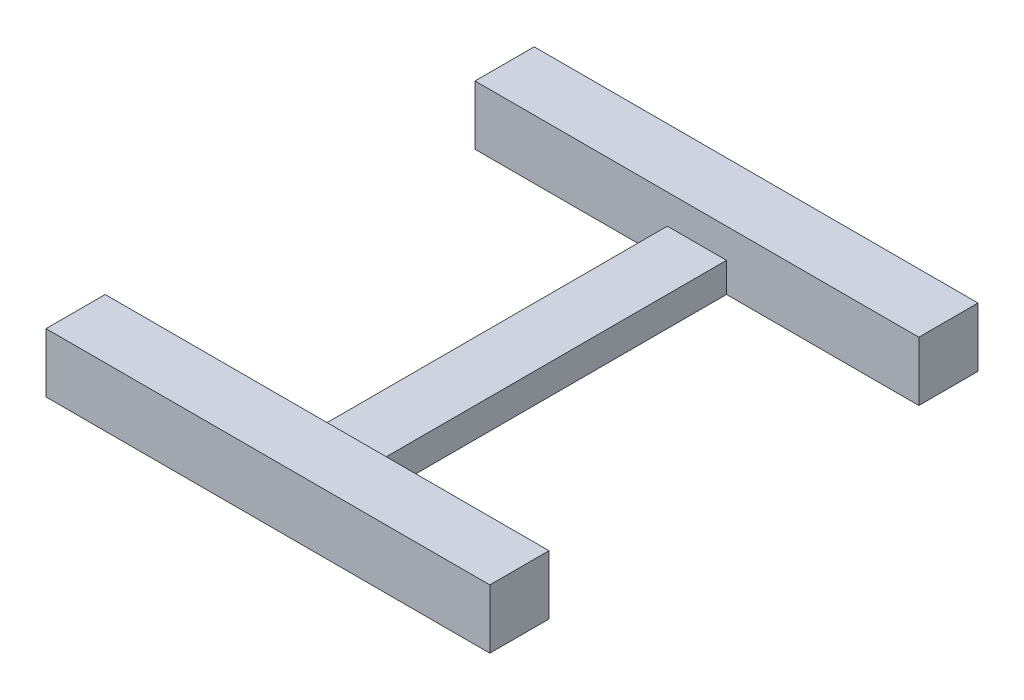
ISO-10303-21;
HEADER;
FILE_DESCRIPTION(('STEP AP214'),'2;1');
FILE_NAME('part.step','',(''),(''),'','','');
FILE_SCHEMA(('AUTOMOTIVE_DESIGN { 1 0 10303 214 1 1 1 1 }'));
ENDSEC;
DATA;
#1=APPLICATION_CONTEXT('core data for automotive mechanical design processes');
#2=APPLICATION_PROTOCOL_DEFINITION('international standard','automotive_design',2000,#1);
#3=PRODUCT_CONTEXT('',#1,'mechanical');
#4=PRODUCT('Part','Part','',(#3));
#5=PRODUCT_RELATED_PRODUCT_CATEGORY('part','',(#4));
#6=PRODUCT_DEFINITION_FORMATION('','',#4);
#7=PRODUCT_DEFINITION_CONTEXT('part definition',#1,'design');
#8=PRODUCT_DEFINITION('design','',#6,#7);
#9=PRODUCT_DEFINITION_SHAPE('','',#8);
#10=(LENGTH_UNIT() NAMED_UNIT(*) SI_UNIT(.MILLI.,.METRE.));
#11=(NAMED_UNIT(*) PLANE_ANGLE_UNIT() SI_UNIT($,.RADIAN.));
#12=(NAMED_UNIT(*) SI_UNIT($,.STERADIAN.) SOLID_ANGLE_UNIT());
#13=UNCERTAINTY_MEASURE_WITH_UNIT(LENGTH_MEASURE(1.E-05),#10,'distance_accuracy_value','');
#14=(GEOMETRIC_REPRESENTATION_CONTEXT(3) GLOBAL_UNCERTAINTY_ASSIGNED_CONTEXT((#13)) GLOBAL_UNIT_ASSIGNED_CONTEXT((#10,
#11,#12)) REPRESENTATION_CONTEXT('',''));
#15=CARTESIAN_POINT('',(0.,0.,0.));
#16=DIRECTION('',(0.,0.,1.));
#17=DIRECTION('',(1.,0.,0.));
#18=AXIS2_PLACEMENT_3D('',#15,#16,#17);
#19=CARTESIAN_POINT('',(0.,4.,0.));
#20=DIRECTION('',(0.,1.,0.));
#21=DIRECTION('',(0.,0.,1.));
#22=AXIS2_PLACEMENT_3D('',#19,#20,#21);
#23=PLANE('',#22);
#24=DIRECTION('',(0.,0.,1.));
#25=VECTOR('',#24,1.);
#26=CARTESIAN_POINT('',(-15.,4.,-12.5));
#27=LINE('',#26,#25);
#28=CARTESIAN_POINT('',(-15.,4.,-16.5));
#29=VERTEX_POINT('',#28);
#30=CARTESIAN_POINT('',(-15.,4.,-12.5));
#31=VERTEX_POINT('',#30);
#32=EDGE_CURVE('E145',#29,#31,#27,.T.);
#33=ORIENTED_EDGE('',*,*,#32,.T.);
#34=DIRECTION('',(1.,0.,0.));
#35=VECTOR('',#34,1.);
#36=CARTESIAN_POINT('',(15.,4.,-12.5));
#37=LINE('',#36,#35);
#38=CARTESIAN_POINT('',(15.,4.,-12.5));
#39=VERTEX_POINT('',#38);
#40=EDGE_CURVE('E50',#31,#39,#37,.T.);
#41=ORIENTED_EDGE('',*,*,#40,.T.);
#42=DIRECTION('',(0.,0.,-1.));
#43=VECTOR('',#42,1.);
#44=CARTESIAN_POINT('',(15.,4.,-12.5));
#45=LINE('',#44,#43);
#46=CARTESIAN_POINT('',(15.,4.,-16.5));
#47=VERTEX_POINT('',#46);
#48=EDGE_CURVE('E124',#39,#47,#45,.T.);
#49=ORIENTED_EDGE('',*,*,#48,.T.);
#50=DIRECTION('',(-1.,0.,0.));
#51=VECTOR('',#50,1.);
#52=CARTESIAN_POINT('',(-15.,4.,-16.5));
#53=LINE('',#52,#51);
#54=EDGE_CURVE('E127',#47,#29,#53,.T.);
#55=ORIENTED_EDGE('',*,*,#54,.T.);
#56=EDGE_LOOP('',(#33,#41,#49,#55));
#57=FACE_BOUND('',#56,.T.);
#58=ADVANCED_FACE('F33',(#57),#23,.T.);
#59=CARTESIAN_POINT('',(-15.,4.,12.5));
#60=DIRECTION('',(1.,0.,0.));
#61=DIRECTION('',(0.,0.,-1.));
#62=AXIS2_PLACEMENT_3D('',#59,#60,#61);
#63=PLANE('',#62);
#64=DIRECTION('',(0.,0.,1.));
#65=VECTOR('',#64,1.);
#66=CARTESIAN_POINT('',(-15.,0.,12.5));
#67=LINE('',#66,#65);
#68=CARTESIAN_POINT('',(-15.,0.,12.5));
#69=VERTEX_POINT('',#68);
#70=CARTESIAN_POINT('',(-15.,0.,16.5));
#71=VERTEX_POINT('',#70);
#72=EDGE_CURVE('E152',#69,#71,#67,.T.);
#73=ORIENTED_EDGE('',*,*,#72,.T.);
#74=DIRECTION('',(0.,-1.,0.));
#75=VECTOR('',#74,1.);
#76=CARTESIAN_POINT('',(-15.,4.,16.5));
#77=LINE('',#76,#75);
#78=CARTESIAN_POINT('',(-15.,4.,16.5));
#79=VERTEX_POINT('',#78);
#80=EDGE_CURVE('E42',#79,#71,#77,.T.);
#81=ORIENTED_EDGE('',*,*,#80,.F.);
#82=DIRECTION('',(0.,0.,1.));
#83=VECTOR('',#82,1.);
#84=CARTESIAN_POINT('',(-15.,4.,12.5));
#85=LINE('',#84,#83);
#86=CARTESIAN_POINT('',(-15.,4.,12.5));
#87=VERTEX_POINT('',#86);
#88=EDGE_CURVE('E108',#87,#79,#85,.T.);
#89=ORIENTED_EDGE('',*,*,#88,.F.);
#90=DIRECTION('',(0.,-1.,0.));
#91=VECTOR('',#90,1.);
#92=CARTESIAN_POINT('',(-15.,4.,12.5));
#93=LINE('',#92,#91);
#94=EDGE_CURVE('E11',#87,#69,#93,.T.);
#95=ORIENTED_EDGE('',*,*,#94,.T.);
#96=EDGE_LOOP('',(#73,#81,#89,#95));
#97=FACE_BOUND('',#96,.T.);
#98=ADVANCED_FACE('F35',(#97),#63,.F.);
#99=CARTESIAN_POINT('',(-15.,4.,16.5));
#100=DIRECTION('',(0.,0.,-1.));
#101=DIRECTION('',(-1.,0.,0.));
#102=AXIS2_PLACEMENT_3D('',#99,#100,#101);
#103=PLANE('',#102);
#104=DIRECTION('',(1.,0.,0.));
#105=VECTOR('',#104,1.);
#106=CARTESIAN_POINT('',(-15.,0.,16.5));
#107=LINE('',#106,#105);
#108=CARTESIAN_POINT('',(15.,0.,16.5));
#109=VERTEX_POINT('',#108);
#110=EDGE_CURVE('E155',#71,#109,#107,.T.);
#111=ORIENTED_EDGE('',*,*,#110,.T.);
#112=DIRECTION('',(0.,-1.,0.));
#113=VECTOR('',#112,1.);
#114=CARTESIAN_POINT('',(15.,4.,16.5));
#115=LINE('',#114,#113);
#116=CARTESIAN_POINT('',(15.,4.,16.5));
#117=VERTEX_POINT('',#116);
#118=EDGE_CURVE('E190',#117,#109,#115,.T.);
#119=ORIENTED_EDGE('',*,*,#118,.F.);
#120=DIRECTION('',(1.,0.,0.));
#121=VECTOR('',#120,1.);
#122=CARTESIAN_POINT('',(-15.,4.,16.5));
#123=LINE('',#122,#121);
#124=EDGE_CURVE('E198',#79,#117,#123,.T.);
#125=ORIENTED_EDGE('',*,*,#124,.F.);
#126=ORIENTED_EDGE('',*,*,#80,.T.);
#127=EDGE_LOOP('',(#111,#119,#125,#126));
#128=FACE_BOUND('',#127,.T.);
#129=ADVANCED_FACE('F196',(#128),#103,.F.);
#130=CARTESIAN_POINT('',(15.,4.,12.5));
#131=DIRECTION('',(-1.,0.,0.));
#132=DIRECTION('',(0.,0.,1.));
#133=AXIS2_PLACEMENT_3D('',#130,#131,#132);
#134=PLANE('',#133);
#135=DIRECTION('',(0.,0.,-1.));
#136=VECTOR('',#135,1.);
#137=CARTESIAN_POINT('',(15.,0.,12.5));
#138=LINE('',#137,#136);
#139=CARTESIAN_POINT('',(15.,0.,12.5));
#140=VERTEX_POINT('',#139);
#141=EDGE_CURVE('E157',#109,#140,#138,.T.);
#142=ORIENTED_EDGE('',*,*,#141,.T.);
#143=DIRECTION('',(0.,-1.,0.));
#144=VECTOR('',#143,1.);
#145=CARTESIAN_POINT('',(15.,4.,12.5));
#146=LINE('',#145,#144);
#147=CARTESIAN_POINT('',(15.,4.,12.5));
#148=VERTEX_POINT('',#147);
#149=EDGE_CURVE('E187',#148,#140,#146,.T.);
#150=ORIENTED_EDGE('',*,*,#149,.F.);
#151=DIRECTION('',(0.,0.,-1.));
#152=VECTOR('',#151,1.);
#153=CARTESIAN_POINT('',(15.,4.,12.5));
#154=LINE('',#153,#152);
#155=EDGE_CURVE('E215',#117,#148,#154,.T.);
#156=ORIENTED_EDGE('',*,*,#155,.F.);
#157=ORIENTED_EDGE('',*,*,#118,.T.);
#158=EDGE_LOOP('',(#142,#150,#156,#157));
#159=FACE_BOUND('',#158,.T.);
#160=ADVANCED_FACE('F207',(#159),#134,.F.);
#161=CARTESIAN_POINT('',(2.,4.,12.5));
#162=DIRECTION('',(0.,0.,1.));
#163=DIRECTION('',(1.,0.,0.));
#164=AXIS2_PLACEMENT_3D('',#161,#162,#163);
#165=PLANE('',#164);
#166=DIRECTION('',(-1.,0.,0.));
#167=VECTOR('',#166,1.);
#168=CARTESIAN_POINT('',(2.,0.,12.5));
#169=LINE('',#168,#167);
#170=CARTESIAN_POINT('',(2.,0.,12.5));
#171=VERTEX_POINT('',#170);
#172=EDGE_CURVE('E159',#140,#171,#169,.T.);
#173=ORIENTED_EDGE('',*,*,#172,.T.);
#174=DIRECTION('',(0.,-1.,0.));
#175=VECTOR('',#174,1.);
#176=CARTESIAN_POINT('',(2.,4.,12.5));
#177=LINE('',#176,#175);
#178=CARTESIAN_POINT('',(2.,2.,12.5));
#179=VERTEX_POINT('',#178);
#180=EDGE_CURVE('E185',#179,#171,#177,.T.);
#181=ORIENTED_EDGE('',*,*,#180,.F.);
#182=DIRECTION('',(1.,0.,0.));
#183=VECTOR('',#182,1.);
#184=CARTESIAN_POINT('',(-2.,2.,12.5));
#185=LINE('',#184,#183);
#186=CARTESIAN_POINT('',(-2.,2.,12.5));
#187=VERTEX_POINT('',#186);
#188=EDGE_CURVE('E226',#187,#179,#185,.T.);
#189=ORIENTED_EDGE('',*,*,#188,.F.);
#190=DIRECTION('',(0.,-1.,0.));
#191=VECTOR('',#190,1.);
#192=CARTESIAN_POINT('',(-2.,4.,12.5));
#193=LINE('',#192,#191);
#194=CARTESIAN_POINT('',(-2.,0.,12.5));
#195=VERTEX_POINT('',#194);
#196=EDGE_CURVE('E101',#187,#195,#193,.T.);
#197=ORIENTED_EDGE('',*,*,#196,.T.);
#198=DIRECTION('',(-1.,0.,0.));
#199=VECTOR('',#198,1.);
#200=CARTESIAN_POINT('',(-2.,0.,12.5));
#201=LINE('',#200,#199);
#202=EDGE_CURVE('E150',#195,#69,#201,.T.);
#203=ORIENTED_EDGE('',*,*,#202,.T.);
#204=ORIENTED_EDGE('',*,*,#94,.F.);
#205=DIRECTION('',(-1.,0.,0.));
#206=VECTOR('',#205,1.);
#207=CARTESIAN_POINT('',(-2.,4.,12.5));
#208=LINE('',#207,#206);
#209=EDGE_CURVE('E176',#148,#87,#208,.T.);
#210=ORIENTED_EDGE('',*,*,#209,.F.);
#211=ORIENTED_EDGE('',*,*,#149,.T.);
#212=EDGE_LOOP('',(#173,#181,#189,#197,#203,#204,#210,#211));
#213=FACE_BOUND('',#212,.T.);
#214=ADVANCED_FACE('F209',(#213),#165,.F.);
#215=CARTESIAN_POINT('',(2.,4.,-12.5));
#216=DIRECTION('',(-1.,0.,0.));
#217=DIRECTION('',(0.,0.,1.));
#218=AXIS2_PLACEMENT_3D('',#215,#216,#217);
#219=PLANE('',#218);
#220=DIRECTION('',(0.,-1.,0.));
#221=VECTOR('',#220,1.);
#222=CARTESIAN_POINT('',(2.,4.,-12.5));
#223=LINE('',#222,#221);
#224=CARTESIAN_POINT('',(2.,2.,-12.5));
#225=VERTEX_POINT('',#224);
#226=CARTESIAN_POINT('',(2.,0.,-12.5));
#227=VERTEX_POINT('',#226);
#228=EDGE_CURVE('E183',#225,#227,#223,.T.);
#229=ORIENTED_EDGE('',*,*,#228,.F.);
#230=DIRECTION('',(0.,0.,-1.));
#231=VECTOR('',#230,1.);
#232=CARTESIAN_POINT('',(2.,2.,12.5));
#233=LINE('',#232,#231);
#234=EDGE_CURVE('E223',#179,#225,#233,.T.);
#235=ORIENTED_EDGE('',*,*,#234,.F.);
#236=ORIENTED_EDGE('',*,*,#180,.T.);
#237=DIRECTION('',(0.,0.,-1.));
#238=VECTOR('',#237,1.);
#239=CARTESIAN_POINT('',(2.,0.,-12.5));
#240=LINE('',#239,#238);
#241=EDGE_CURVE('E162',#171,#227,#240,.T.);
#242=ORIENTED_EDGE('',*,*,#241,.T.);
#243=EDGE_LOOP('',(#229,#235,#236,#242));
#244=FACE_BOUND('',#243,.T.);
#245=ADVANCED_FACE('F281',(#244),#219,.F.);
#246=CARTESIAN_POINT('',(15.,4.,-12.5));
#247=DIRECTION('',(-1.,0.,0.));
#248=DIRECTION('',(0.,0.,1.));
#249=AXIS2_PLACEMENT_3D('',#246,#247,#248);
#250=PLANE('',#249);
#251=DIRECTION('',(0.,0.,-1.));
#252=VECTOR('',#251,1.);
#253=CARTESIAN_POINT('',(15.,0.,-12.5));
#254=LINE('',#253,#252);
#255=CARTESIAN_POINT('',(15.,0.,-12.5));
#256=VERTEX_POINT('',#255);
#257=CARTESIAN_POINT('',(15.,0.,-16.5));
#258=VERTEX_POINT('',#257);
#259=EDGE_CURVE('E136',#256,#258,#254,.T.);
#260=ORIENTED_EDGE('',*,*,#259,.T.);
#261=DIRECTION('',(0.,-1.,0.));
#262=VECTOR('',#261,1.);
#263=CARTESIAN_POINT('',(15.,4.,-16.5));
#264=LINE('',#263,#262);
#265=EDGE_CURVE('E133',#47,#258,#264,.T.);
#266=ORIENTED_EDGE('',*,*,#265,.F.);
#267=ORIENTED_EDGE('',*,*,#48,.F.);
#268=DIRECTION('',(0.,-1.,0.));
#269=VECTOR('',#268,1.);
#270=CARTESIAN_POINT('',(15.,4.,-12.5));
#271=LINE('',#270,#269);
#272=EDGE_CURVE('E139',#39,#256,#271,.T.);
#273=ORIENTED_EDGE('',*,*,#272,.T.);
#274=EDGE_LOOP('',(#260,#266,#267,#273));
#275=FACE_BOUND('',#274,.T.);
#276=ADVANCED_FACE('F134',(#275),#250,.F.);
#277=CARTESIAN_POINT('',(-15.,4.,-16.5));
#278=DIRECTION('',(0.,0.,1.));
#279=DIRECTION('',(1.,0.,0.));
#280=AXIS2_PLACEMENT_3D('',#277,#278,#279);
#281=PLANE('',#280);
#282=DIRECTION('',(-1.,0.,0.));
#283=VECTOR('',#282,1.);
#284=CARTESIAN_POINT('',(-15.,0.,-16.5));
#285=LINE('',#284,#283);
#286=CARTESIAN_POINT('',(-15.,0.,-16.5));
#287=VERTEX_POINT('',#286);
#288=EDGE_CURVE('E168',#258,#287,#285,.T.);
#289=ORIENTED_EDGE('',*,*,#288,.T.);
#290=DIRECTION('',(0.,-1.,0.));
#291=VECTOR('',#290,1.);
#292=CARTESIAN_POINT('',(-15.,4.,-16.5));
#293=LINE('',#292,#291);
#294=EDGE_CURVE('E140',#29,#287,#293,.T.);
#295=ORIENTED_EDGE('',*,*,#294,.F.);
#296=ORIENTED_EDGE('',*,*,#54,.F.);
#297=ORIENTED_EDGE('',*,*,#265,.T.);
#298=EDGE_LOOP('',(#289,#295,#296,#297));
#299=FACE_BOUND('',#298,.T.);
#300=ADVANCED_FACE('F142',(#299),#281,.F.);
#301=CARTESIAN_POINT('',(-15.,4.,-12.5));
#302=DIRECTION('',(1.,0.,0.));
#303=DIRECTION('',(0.,0.,-1.));
#304=AXIS2_PLACEMENT_3D('',#301,#302,#303);
#305=PLANE('',#304);
#306=DIRECTION('',(0.,0.,1.));
#307=VECTOR('',#306,1.);
#308=CARTESIAN_POINT('',(-15.,0.,-12.5));
#309=LINE('',#308,#307);
#310=CARTESIAN_POINT('',(-15.,0.,-12.5));
#311=VERTEX_POINT('',#310);
#312=EDGE_CURVE('E170',#287,#311,#309,.T.);
#313=ORIENTED_EDGE('',*,*,#312,.T.);
#314=DIRECTION('',(0.,-1.,0.));
#315=VECTOR('',#314,1.);
#316=CARTESIAN_POINT('',(-15.,4.,-12.5));
#317=LINE('',#316,#315);
#318=EDGE_CURVE('E179',#31,#311,#317,.T.);
#319=ORIENTED_EDGE('',*,*,#318,.F.);
#320=ORIENTED_EDGE('',*,*,#32,.F.);
#321=ORIENTED_EDGE('',*,*,#294,.T.);
#322=EDGE_LOOP('',(#313,#319,#320,#321));
#323=FACE_BOUND('',#322,.T.);
#324=ADVANCED_FACE('F245',(#323),#305,.F.);
#325=CARTESIAN_POINT('',(-15.,4.,-12.5));
#326=DIRECTION('',(0.,0.,-1.));
#327=DIRECTION('',(-1.,0.,0.));
#328=AXIS2_PLACEMENT_3D('',#325,#326,#327);
#329=PLANE('',#328);
#330=DIRECTION('',(1.,0.,0.));
#331=VECTOR('',#330,1.);
#332=CARTESIAN_POINT('',(-15.,0.,-12.5));
#333=LINE('',#332,#331);
#334=CARTESIAN_POINT('',(-2.00000000000001,0.,-12.5));
#335=VERTEX_POINT('',#334);
#336=EDGE_CURVE('E172',#311,#335,#333,.T.);
#337=ORIENTED_EDGE('',*,*,#336,.T.);
#338=DIRECTION('',(0.,-1.,0.));
#339=VECTOR('',#338,1.);
#340=CARTESIAN_POINT('',(-2.00000000000001,4.,-12.5));
#341=LINE('',#340,#339);
#342=CARTESIAN_POINT('',(-2.,2.,-12.5));
#343=VERTEX_POINT('',#342);
#344=EDGE_CURVE('E93',#343,#335,#341,.T.);
#345=ORIENTED_EDGE('',*,*,#344,.F.);
#346=DIRECTION('',(-1.,0.,0.));
#347=VECTOR('',#346,1.);
#348=CARTESIAN_POINT('',(-2.,2.,-12.5));
#349=LINE('',#348,#347);
#350=EDGE_CURVE('E153',#225,#343,#349,.T.);
#351=ORIENTED_EDGE('',*,*,#350,.F.);
#352=ORIENTED_EDGE('',*,*,#228,.T.);
#353=DIRECTION('',(1.,0.,0.));
#354=VECTOR('',#353,1.);
#355=CARTESIAN_POINT('',(15.,0.,-12.5));
#356=LINE('',#355,#354);
#357=EDGE_CURVE('E165',#227,#256,#356,.T.);
#358=ORIENTED_EDGE('',*,*,#357,.T.);
#359=ORIENTED_EDGE('',*,*,#272,.F.);
#360=ORIENTED_EDGE('',*,*,#40,.F.);
#361=ORIENTED_EDGE('',*,*,#318,.T.);
#362=EDGE_LOOP('',(#337,#345,#351,#352,#358,#359,#360,#361));
#363=FACE_BOUND('',#362,.T.);
#364=ADVANCED_FACE('F242',(#363),#329,.F.);
#365=CARTESIAN_POINT('',(-2.00000000000001,4.,-12.5));
#366=DIRECTION('',(1.,0.,0.));
#367=DIRECTION('',(0.,0.,-1.));
#368=AXIS2_PLACEMENT_3D('',#365,#366,#367);
#369=PLANE('',#368);
#370=ORIENTED_EDGE('',*,*,#196,.F.);
#371=DIRECTION('',(0.,0.,1.));
#372=VECTOR('',#371,1.);
#373=CARTESIAN_POINT('',(-2.,2.,12.5));
#374=LINE('',#373,#372);
#375=EDGE_CURVE('E229',#343,#187,#374,.T.);
#376=ORIENTED_EDGE('',*,*,#375,.F.);
#377=ORIENTED_EDGE('',*,*,#344,.T.);
#378=DIRECTION('',(0.,0.,1.));
#379=VECTOR('',#378,1.);
#380=CARTESIAN_POINT('',(-2.00000000000001,0.,-12.5));
#381=LINE('',#380,#379);
#382=EDGE_CURVE('E174',#335,#195,#381,.T.);
#383=ORIENTED_EDGE('',*,*,#382,.T.);
#384=EDGE_LOOP('',(#370,#376,#377,#383));
#385=FACE_BOUND('',#384,.T.);
#386=ADVANCED_FACE('F238',(#385),#369,.F.);
#387=ORIENTED_EDGE('',*,*,#155,.T.);
#388=ORIENTED_EDGE('',*,*,#209,.T.);
#389=ORIENTED_EDGE('',*,*,#88,.T.);
#390=ORIENTED_EDGE('',*,*,#124,.T.);
#391=EDGE_LOOP('',(#387,#388,#389,#390));
#392=FACE_BOUND('',#391,.T.);
#393=ADVANCED_FACE('F216',(#392),#23,.T.);
#394=CARTESIAN_POINT('',(0.,0.,0.));
#395=DIRECTION('',(0.,1.,0.));
#396=DIRECTION('',(0.,0.,1.));
#397=AXIS2_PLACEMENT_3D('',#394,#395,#396);
#398=PLANE('',#397);
#399=ORIENTED_EDGE('',*,*,#202,.F.);
#400=ORIENTED_EDGE('',*,*,#382,.F.);
#401=ORIENTED_EDGE('',*,*,#336,.F.);
#402=ORIENTED_EDGE('',*,*,#312,.F.);
#403=ORIENTED_EDGE('',*,*,#288,.F.);
#404=ORIENTED_EDGE('',*,*,#259,.F.);
#405=ORIENTED_EDGE('',*,*,#357,.F.);
#406=ORIENTED_EDGE('',*,*,#241,.F.);
#407=ORIENTED_EDGE('',*,*,#172,.F.);
#408=ORIENTED_EDGE('',*,*,#141,.F.);
#409=ORIENTED_EDGE('',*,*,#110,.F.);
#410=ORIENTED_EDGE('',*,*,#72,.F.);
#411=EDGE_LOOP('',(#399,#400,#401,#402,#403,#404,#405,#406,#407,#408,#409,#410));
#412=FACE_BOUND('',#411,.T.);
#413=ADVANCED_FACE('F202',(#412),#398,.F.);
#414=CARTESIAN_POINT('',(0.,2.,0.));
#415=DIRECTION('',(0.,-1.,0.));
#416=DIRECTION('',(0.,0.,-1.));
#417=AXIS2_PLACEMENT_3D('',#414,#415,#416);
#418=PLANE('',#417);
#419=ORIENTED_EDGE('',*,*,#375,.T.);
#420=ORIENTED_EDGE('',*,*,#188,.T.);
#421=ORIENTED_EDGE('',*,*,#234,.T.);
#422=ORIENTED_EDGE('',*,*,#350,.T.);
#423=EDGE_LOOP('',(#419,#420,#421,#422));
#424=FACE_BOUND('',#423,.T.);
#425=ADVANCED_FACE('F233',(#424),#418,.F.);
#426=CLOSED_SHELL('',(#58,#98,#129,#160,#214,#245,#276,#300,#324,#364,#386,#393,#413,#425));
#427=MANIFOLD_SOLID_BREP('B2',#426);
#428=ADVANCED_BREP_SHAPE_REPRESENTATION('',(#18,#427),#14);
#429=SHAPE_DEFINITION_REPRESENTATION(#9,#428);
ENDSEC;
END-ISO-10303-21;
